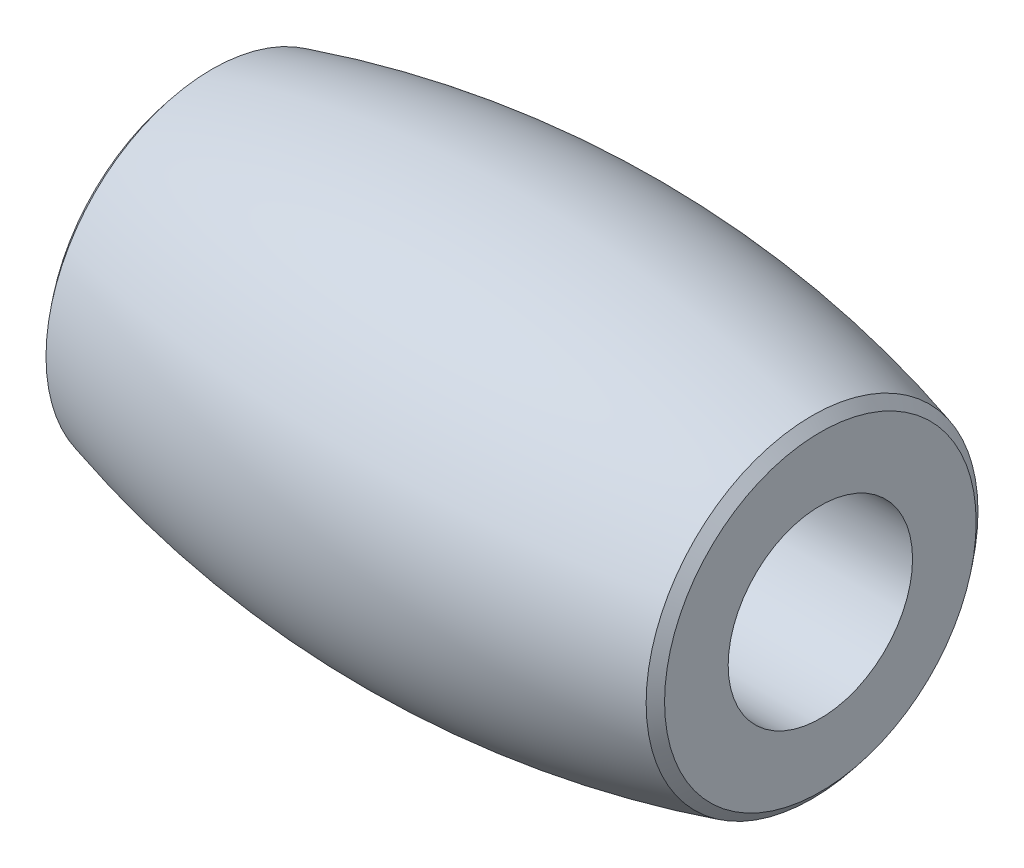
ISO-10303-21;
HEADER;
FILE_DESCRIPTION(('STEP AP214'),'2;1');
FILE_NAME('part.step','',(''),(''),'','','');
FILE_SCHEMA(('AUTOMOTIVE_DESIGN { 1 0 10303 214 1 1 1 1 }'));
ENDSEC;
DATA;
#1=APPLICATION_CONTEXT('core data for automotive mechanical design processes');
#2=APPLICATION_PROTOCOL_DEFINITION('international standard','automotive_design',2000,#1);
#3=PRODUCT_CONTEXT('',#1,'mechanical');
#4=PRODUCT('Part','Part','',(#3));
#5=PRODUCT_RELATED_PRODUCT_CATEGORY('part','',(#4));
#6=PRODUCT_DEFINITION_FORMATION('','',#4);
#7=PRODUCT_DEFINITION_CONTEXT('part definition',#1,'design');
#8=PRODUCT_DEFINITION('design','',#6,#7);
#9=PRODUCT_DEFINITION_SHAPE('','',#8);
#10=(LENGTH_UNIT() NAMED_UNIT(*) SI_UNIT(.MILLI.,.METRE.));
#11=(NAMED_UNIT(*) PLANE_ANGLE_UNIT() SI_UNIT($,.RADIAN.));
#12=(NAMED_UNIT(*) SI_UNIT($,.STERADIAN.) SOLID_ANGLE_UNIT());
#13=UNCERTAINTY_MEASURE_WITH_UNIT(LENGTH_MEASURE(1.E-05),#10,'distance_accuracy_value','');
#14=(GEOMETRIC_REPRESENTATION_CONTEXT(3) GLOBAL_UNCERTAINTY_ASSIGNED_CONTEXT((#13)) GLOBAL_UNIT_ASSIGNED_CONTEXT((#10,
#11,#12)) REPRESENTATION_CONTEXT('',''));
#15=CARTESIAN_POINT('',(0.,0.,0.));
#16=DIRECTION('',(0.,0.,1.));
#17=DIRECTION('',(1.,0.,0.));
#18=AXIS2_PLACEMENT_3D('',#15,#16,#17);
#19=CARTESIAN_POINT('',(-6.69,1.,0.));
#20=DIRECTION('',(-1.,0.,0.));
#21=DIRECTION('',(0.,0.,1.));
#22=AXIS2_PLACEMENT_3D('',#19,#20,#21);
#23=PLANE('',#22);
#24=CARTESIAN_POINT('',(-6.69,0.,0.));
#25=DIRECTION('',(1.,0.,0.));
#26=DIRECTION('',(0.,0.,1.));
#27=AXIS2_PLACEMENT_3D('',#24,#25,#26);
#28=CIRCLE('',#27,2.);
#29=CARTESIAN_POINT('',(-6.69,0.,2.));
#30=VERTEX_POINT('',#29);
#31=EDGE_CURVE('E48',#30,#30,#28,.T.);
#32=ORIENTED_EDGE('',*,*,#31,.T.);
#33=EDGE_LOOP('',(#32));
#34=FACE_BOUND('',#33,.T.);
#35=CARTESIAN_POINT('',(-6.69,0.,0.));
#36=DIRECTION('',(1.,0.,0.));
#37=DIRECTION('',(0.,0.,-1.));
#38=AXIS2_PLACEMENT_3D('',#35,#36,#37);
#39=CIRCLE('',#38,3.38);
#40=CARTESIAN_POINT('',(-6.69,0.,-3.38));
#41=VERTEX_POINT('',#40);
#42=EDGE_CURVE('E38',#41,#41,#39,.T.);
#43=ORIENTED_EDGE('',*,*,#42,.F.);
#44=EDGE_LOOP('',(#43));
#45=FACE_BOUND('',#44,.T.);
#46=ADVANCED_FACE('F15',(#34,#45),#23,.T.);
#47=CARTESIAN_POINT('',(6.69,1.,0.));
#48=DIRECTION('',(1.,0.,0.));
#49=DIRECTION('',(0.,1.,0.));
#50=AXIS2_PLACEMENT_3D('',#47,#48,#49);
#51=PLANE('',#50);
#52=CARTESIAN_POINT('',(6.69,0.,0.));
#53=DIRECTION('',(1.,0.,0.));
#54=DIRECTION('',(0.,0.,-1.));
#55=AXIS2_PLACEMENT_3D('',#52,#53,#54);
#56=CIRCLE('',#55,2.);
#57=CARTESIAN_POINT('',(6.69,0.,-2.));
#58=VERTEX_POINT('',#57);
#59=EDGE_CURVE('E44',#58,#58,#56,.T.);
#60=ORIENTED_EDGE('',*,*,#59,.F.);
#61=EDGE_LOOP('',(#60));
#62=FACE_BOUND('',#61,.T.);
#63=CARTESIAN_POINT('',(6.69,0.,0.));
#64=DIRECTION('',(1.,0.,0.));
#65=DIRECTION('',(0.,0.,-1.));
#66=AXIS2_PLACEMENT_3D('',#63,#64,#65);
#67=CIRCLE('',#66,3.38);
#68=CARTESIAN_POINT('',(6.69,0.,-3.38));
#69=VERTEX_POINT('',#68);
#70=EDGE_CURVE('E10',#69,#69,#67,.T.);
#71=ORIENTED_EDGE('',*,*,#70,.T.);
#72=EDGE_LOOP('',(#71));
#73=FACE_BOUND('',#72,.T.);
#74=ADVANCED_FACE('F70',(#62,#73),#51,.T.);
#75=CARTESIAN_POINT('',(6.69,0.,0.));
#76=DIRECTION('',(-1.,0.,0.));
#77=DIRECTION('',(0.,0.,1.));
#78=AXIS2_PLACEMENT_3D('',#75,#76,#77);
#79=CONICAL_SURFACE('',#78,3.38,0.885066815888622);
#80=CARTESIAN_POINT('',(6.51,0.,0.));
#81=DIRECTION('',(1.,0.,0.));
#82=DIRECTION('',(0.,0.,-1.));
#83=AXIS2_PLACEMENT_3D('',#80,#81,#82);
#84=CIRCLE('',#83,3.6);
#85=CARTESIAN_POINT('',(6.51,0.,-3.6));
#86=VERTEX_POINT('',#85);
#87=EDGE_CURVE('E22',#86,#86,#84,.T.);
#88=ORIENTED_EDGE('',*,*,#87,.T.);
#89=EDGE_LOOP('',(#88));
#90=FACE_BOUND('',#89,.T.);
#91=ORIENTED_EDGE('',*,*,#70,.F.);
#92=EDGE_LOOP('',(#91));
#93=FACE_BOUND('',#92,.T.);
#94=ADVANCED_FACE('F74',(#90,#93),#79,.T.);
#95=CARTESIAN_POINT('',(0.,0.,0.));
#96=DIRECTION('',(1.,0.,0.));
#97=DIRECTION('',(0.,0.,1.));
#98=AXIS2_PLACEMENT_3D('',#95,#96,#97);
#99=DEGENERATE_TOROIDAL_SURFACE('',#98,19.5002142847204,24.,.F.);
#100=ORIENTED_EDGE('',*,*,#87,.F.);
#101=EDGE_LOOP('',(#100));
#102=FACE_BOUND('',#101,.T.);
#103=CARTESIAN_POINT('',(-6.51,0.,0.));
#104=DIRECTION('',(1.,0.,0.));
#105=DIRECTION('',(0.,0.,-1.));
#106=AXIS2_PLACEMENT_3D('',#103,#104,#105);
#107=CIRCLE('',#106,3.6);
#108=CARTESIAN_POINT('',(-6.51,0.,-3.6));
#109=VERTEX_POINT('',#108);
#110=EDGE_CURVE('E31',#109,#109,#107,.T.);
#111=ORIENTED_EDGE('',*,*,#110,.T.);
#112=EDGE_LOOP('',(#111));
#113=FACE_BOUND('',#112,.T.);
#114=ADVANCED_FACE('F66',(#102,#113),#99,.F.);
#115=CARTESIAN_POINT('',(-6.51,0.,0.));
#116=DIRECTION('',(1.,0.,0.));
#117=DIRECTION('',(0.,0.,-1.));
#118=AXIS2_PLACEMENT_3D('',#115,#116,#117);
#119=CONICAL_SURFACE('',#118,3.6,0.885066815888611);
#120=ORIENTED_EDGE('',*,*,#110,.F.);
#121=EDGE_LOOP('',(#120));
#122=FACE_BOUND('',#121,.T.);
#123=ORIENTED_EDGE('',*,*,#42,.T.);
#124=EDGE_LOOP('',(#123));
#125=FACE_BOUND('',#124,.T.);
#126=ADVANCED_FACE('F59',(#122,#125),#119,.T.);
#127=CARTESIAN_POINT('',(-6.691,0.,0.));
#128=DIRECTION('',(1.,0.,0.));
#129=DIRECTION('',(0.,0.,-1.));
#130=AXIS2_PLACEMENT_3D('',#127,#128,#129);
#131=CYLINDRICAL_SURFACE('',#130,2.);
#132=ORIENTED_EDGE('',*,*,#59,.T.);
#133=EDGE_LOOP('',(#132));
#134=FACE_BOUND('',#133,.T.);
#135=ORIENTED_EDGE('',*,*,#31,.F.);
#136=EDGE_LOOP('',(#135));
#137=FACE_BOUND('',#136,.T.);
#138=ADVANCED_FACE('F57',(#134,#137),#131,.F.);
#139=CLOSED_SHELL('',(#46,#74,#94,#114,#126,#138));
#140=MANIFOLD_SOLID_BREP('B1',#139);
#141=ADVANCED_BREP_SHAPE_REPRESENTATION('',(#18,#140),#14);
#142=SHAPE_DEFINITION_REPRESENTATION(#9,#141);
ENDSEC;
END-ISO-10303-21;
